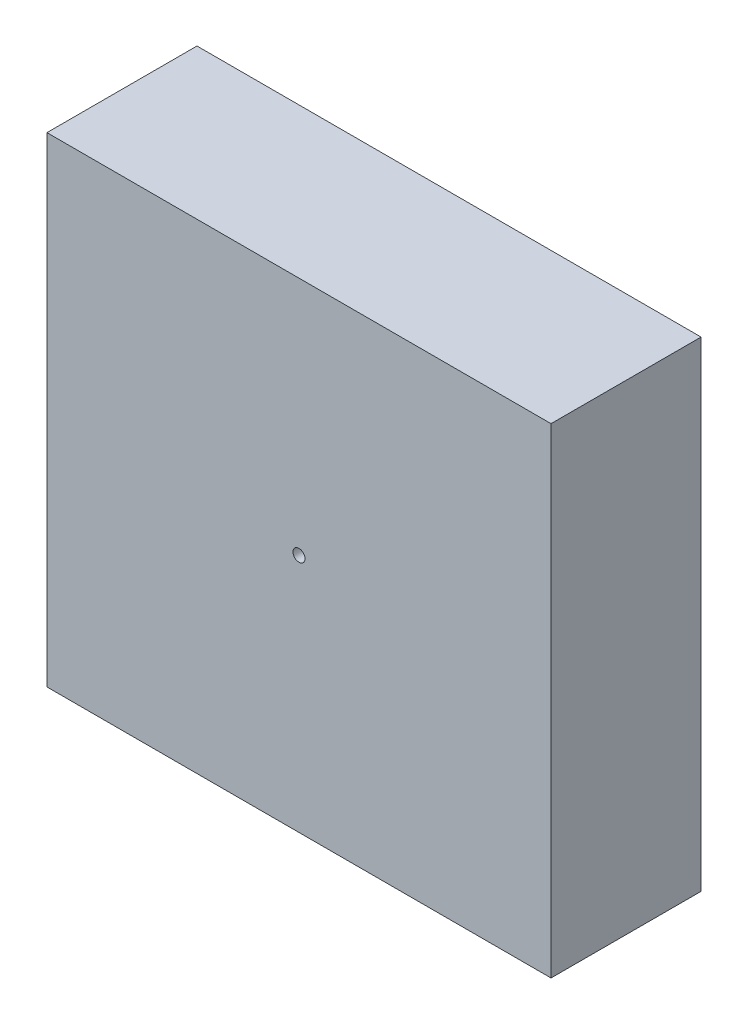
ISO-10303-21;
HEADER;
FILE_DESCRIPTION(('STEP AP214'),'2;1');
FILE_NAME('part.step','',(''),(''),'','','');
FILE_SCHEMA(('AUTOMOTIVE_DESIGN { 1 0 10303 214 1 1 1 1 }'));
ENDSEC;
DATA;
#1=APPLICATION_CONTEXT('core data for automotive mechanical design processes');
#2=APPLICATION_PROTOCOL_DEFINITION('international standard','automotive_design',2000,#1);
#3=PRODUCT_CONTEXT('',#1,'mechanical');
#4=PRODUCT('Part','Part','',(#3));
#5=PRODUCT_RELATED_PRODUCT_CATEGORY('part','',(#4));
#6=PRODUCT_DEFINITION_FORMATION('','',#4);
#7=PRODUCT_DEFINITION_CONTEXT('part definition',#1,'design');
#8=PRODUCT_DEFINITION('design','',#6,#7);
#9=PRODUCT_DEFINITION_SHAPE('','',#8);
#10=(LENGTH_UNIT() NAMED_UNIT(*) SI_UNIT(.MILLI.,.METRE.));
#11=(NAMED_UNIT(*) PLANE_ANGLE_UNIT() SI_UNIT($,.RADIAN.));
#12=(NAMED_UNIT(*) SI_UNIT($,.STERADIAN.) SOLID_ANGLE_UNIT());
#13=UNCERTAINTY_MEASURE_WITH_UNIT(LENGTH_MEASURE(1.E-05),#10,'distance_accuracy_value','');
#14=(GEOMETRIC_REPRESENTATION_CONTEXT(3) GLOBAL_UNCERTAINTY_ASSIGNED_CONTEXT((#13)) GLOBAL_UNIT_ASSIGNED_CONTEXT((#10,
#11,#12)) REPRESENTATION_CONTEXT('',''));
#15=CARTESIAN_POINT('',(0.,0.,0.));
#16=DIRECTION('',(0.,0.,1.));
#17=DIRECTION('',(1.,0.,0.));
#18=AXIS2_PLACEMENT_3D('',#15,#16,#17);
#19=CARTESIAN_POINT('',(42.,40.,25.));
#20=DIRECTION('',(-1.,0.,0.));
#21=DIRECTION('',(0.,0.,1.));
#22=AXIS2_PLACEMENT_3D('',#19,#20,#21);
#23=PLANE('',#22);
#24=DIRECTION('',(0.,1.,0.));
#25=VECTOR('',#24,1.);
#26=CARTESIAN_POINT('',(42.,40.,0.));
#27=LINE('',#26,#25);
#28=CARTESIAN_POINT('',(42.,-40.,0.));
#29=VERTEX_POINT('',#28);
#30=CARTESIAN_POINT('',(42.,40.,0.));
#31=VERTEX_POINT('',#30);
#32=EDGE_CURVE('E100',#29,#31,#27,.T.);
#33=ORIENTED_EDGE('',*,*,#32,.T.);
#34=DIRECTION('',(0.,0.,-1.));
#35=VECTOR('',#34,1.);
#36=CARTESIAN_POINT('',(42.,40.,25.));
#37=LINE('',#36,#35);
#38=CARTESIAN_POINT('',(42.,40.,25.));
#39=VERTEX_POINT('',#38);
#40=EDGE_CURVE('E11',#39,#31,#37,.T.);
#41=ORIENTED_EDGE('',*,*,#40,.F.);
#42=DIRECTION('',(0.,1.,0.));
#43=VECTOR('',#42,1.);
#44=CARTESIAN_POINT('',(42.,40.,25.));
#45=LINE('',#44,#43);
#46=CARTESIAN_POINT('',(42.,-40.,25.));
#47=VERTEX_POINT('',#46);
#48=EDGE_CURVE('E88',#47,#39,#45,.T.);
#49=ORIENTED_EDGE('',*,*,#48,.F.);
#50=DIRECTION('',(0.,0.,-1.));
#51=VECTOR('',#50,1.);
#52=CARTESIAN_POINT('',(42.,-40.,25.));
#53=LINE('',#52,#51);
#54=EDGE_CURVE('E96',#47,#29,#53,.T.);
#55=ORIENTED_EDGE('',*,*,#54,.T.);
#56=EDGE_LOOP('',(#33,#41,#49,#55));
#57=FACE_BOUND('',#56,.T.);
#58=ADVANCED_FACE('F37',(#57),#23,.F.);
#59=CARTESIAN_POINT('',(-42.,40.,25.));
#60=DIRECTION('',(0.,-1.,0.));
#61=DIRECTION('',(0.,0.,-1.));
#62=AXIS2_PLACEMENT_3D('',#59,#60,#61);
#63=PLANE('',#62);
#64=DIRECTION('',(-1.,0.,0.));
#65=VECTOR('',#64,1.);
#66=CARTESIAN_POINT('',(-42.,40.,0.));
#67=LINE('',#66,#65);
#68=CARTESIAN_POINT('',(-42.,40.,0.));
#69=VERTEX_POINT('',#68);
#70=EDGE_CURVE('E92',#31,#69,#67,.T.);
#71=ORIENTED_EDGE('',*,*,#70,.T.);
#72=DIRECTION('',(0.,0.,-1.));
#73=VECTOR('',#72,1.);
#74=CARTESIAN_POINT('',(-42.,40.,25.));
#75=LINE('',#74,#73);
#76=CARTESIAN_POINT('',(-42.,40.,25.));
#77=VERTEX_POINT('',#76);
#78=EDGE_CURVE('E45',#77,#69,#75,.T.);
#79=ORIENTED_EDGE('',*,*,#78,.F.);
#80=DIRECTION('',(-1.,0.,0.));
#81=VECTOR('',#80,1.);
#82=CARTESIAN_POINT('',(-42.,40.,25.));
#83=LINE('',#82,#81);
#84=EDGE_CURVE('E83',#39,#77,#83,.T.);
#85=ORIENTED_EDGE('',*,*,#84,.F.);
#86=ORIENTED_EDGE('',*,*,#40,.T.);
#87=EDGE_LOOP('',(#71,#79,#85,#86));
#88=FACE_BOUND('',#87,.T.);
#89=ADVANCED_FACE('F91',(#88),#63,.F.);
#90=CARTESIAN_POINT('',(-42.,40.,25.));
#91=DIRECTION('',(1.,0.,0.));
#92=DIRECTION('',(0.,1.,0.));
#93=AXIS2_PLACEMENT_3D('',#90,#91,#92);
#94=PLANE('',#93);
#95=DIRECTION('',(0.,-1.,0.));
#96=VECTOR('',#95,1.);
#97=CARTESIAN_POINT('',(-42.,40.,0.));
#98=LINE('',#97,#96);
#99=CARTESIAN_POINT('',(-42.,-40.,0.));
#100=VERTEX_POINT('',#99);
#101=EDGE_CURVE('E70',#69,#100,#98,.T.);
#102=ORIENTED_EDGE('',*,*,#101,.T.);
#103=DIRECTION('',(0.,0.,-1.));
#104=VECTOR('',#103,1.);
#105=CARTESIAN_POINT('',(-42.,-40.,25.));
#106=LINE('',#105,#104);
#107=CARTESIAN_POINT('',(-42.,-40.,25.));
#108=VERTEX_POINT('',#107);
#109=EDGE_CURVE('E93',#108,#100,#106,.T.);
#110=ORIENTED_EDGE('',*,*,#109,.F.);
#111=DIRECTION('',(0.,-1.,0.));
#112=VECTOR('',#111,1.);
#113=CARTESIAN_POINT('',(-42.,40.,25.));
#114=LINE('',#113,#112);
#115=EDGE_CURVE('E86',#77,#108,#114,.T.);
#116=ORIENTED_EDGE('',*,*,#115,.F.);
#117=ORIENTED_EDGE('',*,*,#78,.T.);
#118=EDGE_LOOP('',(#102,#110,#116,#117));
#119=FACE_BOUND('',#118,.T.);
#120=ADVANCED_FACE('F94',(#119),#94,.F.);
#121=CARTESIAN_POINT('',(-42.,-40.,25.));
#122=DIRECTION('',(0.,1.,0.));
#123=DIRECTION('',(0.,0.,1.));
#124=AXIS2_PLACEMENT_3D('',#121,#122,#123);
#125=PLANE('',#124);
#126=DIRECTION('',(1.,0.,0.));
#127=VECTOR('',#126,1.);
#128=CARTESIAN_POINT('',(-42.,-40.,0.));
#129=LINE('',#128,#127);
#130=EDGE_CURVE('E76',#100,#29,#129,.T.);
#131=ORIENTED_EDGE('',*,*,#130,.T.);
#132=ORIENTED_EDGE('',*,*,#54,.F.);
#133=DIRECTION('',(1.,0.,0.));
#134=VECTOR('',#133,1.);
#135=CARTESIAN_POINT('',(-42.,-40.,25.));
#136=LINE('',#135,#134);
#137=EDGE_CURVE('E53',#108,#47,#136,.T.);
#138=ORIENTED_EDGE('',*,*,#137,.F.);
#139=ORIENTED_EDGE('',*,*,#109,.T.);
#140=EDGE_LOOP('',(#131,#132,#138,#139));
#141=FACE_BOUND('',#140,.T.);
#142=ADVANCED_FACE('F108',(#141),#125,.F.);
#143=CARTESIAN_POINT('',(0.,0.,25.));
#144=DIRECTION('',(0.,0.,1.));
#145=DIRECTION('',(1.,0.,0.));
#146=AXIS2_PLACEMENT_3D('',#143,#144,#145);
#147=PLANE('',#146);
#148=CARTESIAN_POINT('',(0.,0.,25.));
#149=DIRECTION('',(0.,0.,1.));
#150=DIRECTION('',(1.,0.,0.));
#151=AXIS2_PLACEMENT_3D('',#148,#149,#150);
#152=CIRCLE('',#151,1.);
#153=CARTESIAN_POINT('',(1.,0.,25.));
#154=VERTEX_POINT('',#153);
#155=EDGE_CURVE('E114',#154,#154,#152,.T.);
#156=ORIENTED_EDGE('',*,*,#155,.F.);
#157=EDGE_LOOP('',(#156));
#158=FACE_BOUND('',#157,.T.);
#159=ORIENTED_EDGE('',*,*,#48,.T.);
#160=ORIENTED_EDGE('',*,*,#84,.T.);
#161=ORIENTED_EDGE('',*,*,#115,.T.);
#162=ORIENTED_EDGE('',*,*,#137,.T.);
#163=EDGE_LOOP('',(#159,#160,#161,#162));
#164=FACE_BOUND('',#163,.T.);
#165=ADVANCED_FACE('F84',(#158,#164),#147,.T.);
#166=CARTESIAN_POINT('',(0.,0.,0.));
#167=DIRECTION('',(0.,0.,1.));
#168=DIRECTION('',(1.,0.,0.));
#169=AXIS2_PLACEMENT_3D('',#166,#167,#168);
#170=PLANE('',#169);
#171=ORIENTED_EDGE('',*,*,#32,.F.);
#172=ORIENTED_EDGE('',*,*,#130,.F.);
#173=ORIENTED_EDGE('',*,*,#101,.F.);
#174=ORIENTED_EDGE('',*,*,#70,.F.);
#175=EDGE_LOOP('',(#171,#172,#173,#174));
#176=FACE_BOUND('',#175,.T.);
#177=ADVANCED_FACE('F111',(#176),#170,.F.);
#178=CARTESIAN_POINT('',(0.,0.,15.));
#179=DIRECTION('',(0.,0.,1.));
#180=DIRECTION('',(1.,0.,0.));
#181=AXIS2_PLACEMENT_3D('',#178,#179,#180);
#182=CYLINDRICAL_SURFACE('',#181,1.);
#183=CARTESIAN_POINT('',(0.,0.,15.));
#184=DIRECTION('',(0.,0.,1.));
#185=DIRECTION('',(1.,0.,0.));
#186=AXIS2_PLACEMENT_3D('',#183,#184,#185);
#187=CIRCLE('',#186,1.);
#188=CARTESIAN_POINT('',(1.,0.,15.));
#189=VERTEX_POINT('',#188);
#190=EDGE_CURVE('E103',#189,#189,#187,.T.);
#191=ORIENTED_EDGE('',*,*,#190,.F.);
#192=EDGE_LOOP('',(#191));
#193=FACE_BOUND('',#192,.T.);
#194=ORIENTED_EDGE('',*,*,#155,.T.);
#195=EDGE_LOOP('',(#194));
#196=FACE_BOUND('',#195,.T.);
#197=ADVANCED_FACE('F122',(#193,#196),#182,.F.);
#198=CARTESIAN_POINT('',(0.,0.,15.));
#199=DIRECTION('',(0.,0.,1.));
#200=DIRECTION('',(1.,0.,0.));
#201=AXIS2_PLACEMENT_3D('',#198,#199,#200);
#202=PLANE('',#201);
#203=ORIENTED_EDGE('',*,*,#190,.T.);
#204=EDGE_LOOP('',(#203));
#205=FACE_BOUND('',#204,.T.);
#206=ADVANCED_FACE('F120',(#205),#202,.T.);
#207=CLOSED_SHELL('',(#58,#89,#120,#142,#165,#177,#197,#206));
#208=MANIFOLD_SOLID_BREP('B2',#207);
#209=ADVANCED_BREP_SHAPE_REPRESENTATION('',(#18,#208),#14);
#210=SHAPE_DEFINITION_REPRESENTATION(#9,#209);
ENDSEC;
END-ISO-10303-21;
